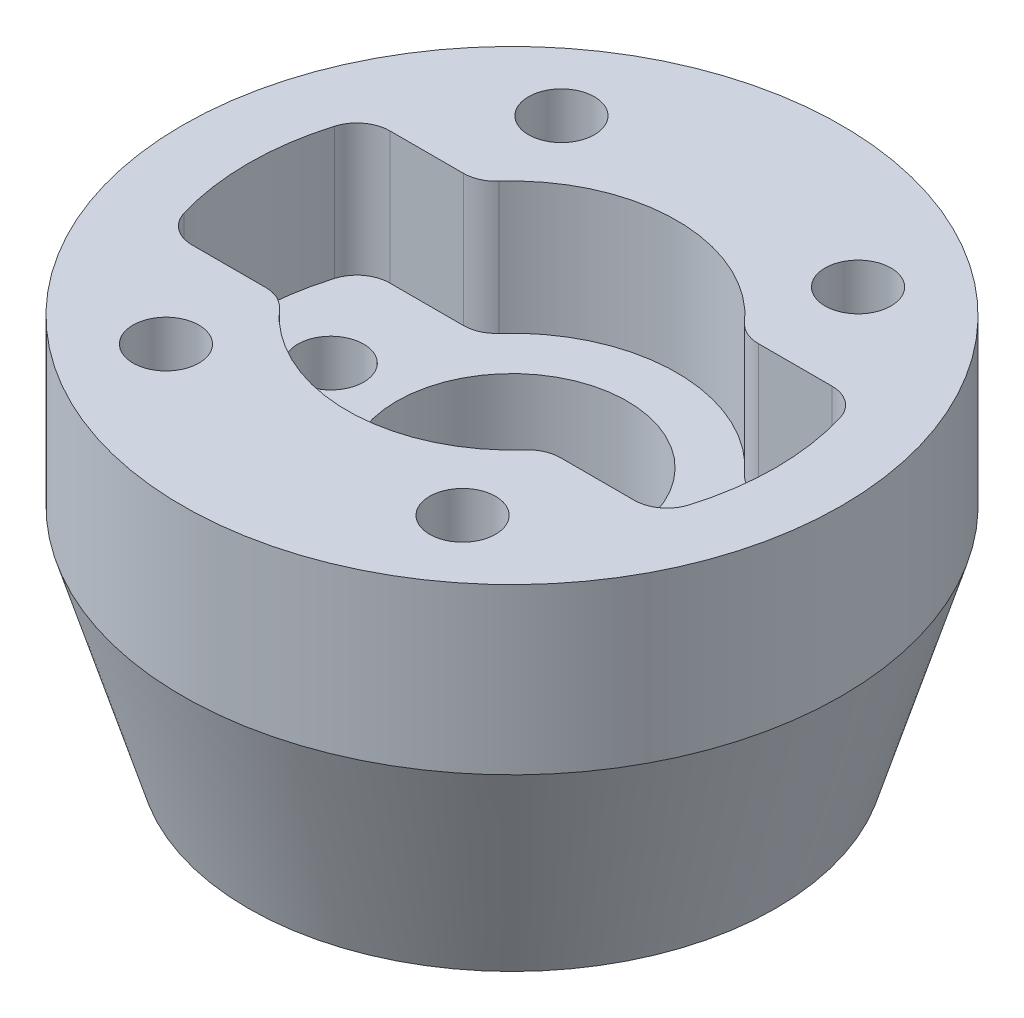
ISO-10303-21;
HEADER;
FILE_DESCRIPTION(('STEP AP214'),'2;1');
FILE_NAME('part.step','',(''),(''),'','','');
FILE_SCHEMA(('AUTOMOTIVE_DESIGN { 1 0 10303 214 1 1 1 1 }'));
ENDSEC;
DATA;
#1=APPLICATION_CONTEXT('core data for automotive mechanical design processes');
#2=APPLICATION_PROTOCOL_DEFINITION('international standard','automotive_design',2000,#1);
#3=PRODUCT_CONTEXT('',#1,'mechanical');
#4=PRODUCT('Part','Part','',(#3));
#5=PRODUCT_RELATED_PRODUCT_CATEGORY('part','',(#4));
#6=PRODUCT_DEFINITION_FORMATION('','',#4);
#7=PRODUCT_DEFINITION_CONTEXT('part definition',#1,'design');
#8=PRODUCT_DEFINITION('design','',#6,#7);
#9=PRODUCT_DEFINITION_SHAPE('','',#8);
#10=(LENGTH_UNIT() NAMED_UNIT(*) SI_UNIT(.MILLI.,.METRE.));
#11=(NAMED_UNIT(*) PLANE_ANGLE_UNIT() SI_UNIT($,.RADIAN.));
#12=(NAMED_UNIT(*) SI_UNIT($,.STERADIAN.) SOLID_ANGLE_UNIT());
#13=UNCERTAINTY_MEASURE_WITH_UNIT(LENGTH_MEASURE(1.E-05),#10,'distance_accuracy_value','');
#14=(GEOMETRIC_REPRESENTATION_CONTEXT(3) GLOBAL_UNCERTAINTY_ASSIGNED_CONTEXT((#13)) GLOBAL_UNIT_ASSIGNED_CONTEXT((#10,
#11,#12)) REPRESENTATION_CONTEXT('',''));
#15=CARTESIAN_POINT('',(0.,0.,0.));
#16=DIRECTION('',(0.,0.,1.));
#17=DIRECTION('',(1.,0.,0.));
#18=AXIS2_PLACEMENT_3D('',#15,#16,#17);
#19=CARTESIAN_POINT('',(0.,0.286130795692241,0.));
#20=DIRECTION('',(0.,1.,0.));
#21=DIRECTION('',(-1.,0.,0.));
#22=AXIS2_PLACEMENT_3D('',#19,#20,#21);
#23=CYLINDRICAL_SURFACE('',#22,3.5);
#24=CARTESIAN_POINT('',(0.,4.,0.));
#25=DIRECTION('',(0.,1.,0.));
#26=DIRECTION('',(-1.,0.,0.));
#27=AXIS2_PLACEMENT_3D('',#24,#25,#26);
#28=CIRCLE('',#27,3.5);
#29=CARTESIAN_POINT('',(-3.5,4.,0.));
#30=VERTEX_POINT('',#29);
#31=EDGE_CURVE('E224',#30,#30,#28,.T.);
#32=ORIENTED_EDGE('',*,*,#31,.F.);
#33=EDGE_LOOP('',(#32));
#34=FACE_BOUND('',#33,.T.);
#35=CARTESIAN_POINT('',(0.,8.5,0.));
#36=DIRECTION('',(0.,1.,0.));
#37=DIRECTION('',(-1.,0.,0.));
#38=AXIS2_PLACEMENT_3D('',#35,#36,#37);
#39=CIRCLE('',#38,3.5);
#40=CARTESIAN_POINT('',(-3.5,8.5,0.));
#41=VERTEX_POINT('',#40);
#42=EDGE_CURVE('E212',#41,#41,#39,.F.);
#43=ORIENTED_EDGE('',*,*,#42,.F.);
#44=EDGE_LOOP('',(#43));
#45=FACE_BOUND('',#44,.T.);
#46=ADVANCED_FACE('F39',(#34,#45),#23,.F.);
#47=CARTESIAN_POINT('',(2.,0.,0.));
#48=DIRECTION('',(0.,1.,0.));
#49=DIRECTION('',(-1.,0.,0.));
#50=AXIS2_PLACEMENT_3D('',#47,#48,#49);
#51=PLANE('',#50);
#52=CARTESIAN_POINT('',(0.,0.,0.));
#53=DIRECTION('',(0.,1.,0.));
#54=DIRECTION('',(-1.,0.,0.));
#55=AXIS2_PLACEMENT_3D('',#52,#53,#54);
#56=CIRCLE('',#55,2.2);
#57=CARTESIAN_POINT('',(-2.2,0.,0.));
#58=VERTEX_POINT('',#57);
#59=EDGE_CURVE('E240',#58,#58,#56,.T.);
#60=ORIENTED_EDGE('',*,*,#59,.F.);
#61=EDGE_LOOP('',(#60));
#62=FACE_BOUND('',#61,.T.);
#63=CARTESIAN_POINT('',(0.,0.,0.));
#64=DIRECTION('',(0.,1.,0.));
#65=DIRECTION('',(-1.,0.,0.));
#66=AXIS2_PLACEMENT_3D('',#63,#64,#65);
#67=CIRCLE('',#66,2.);
#68=CARTESIAN_POINT('',(-2.,0.,0.));
#69=VERTEX_POINT('',#68);
#70=EDGE_CURVE('E207',#69,#69,#67,.T.);
#71=ORIENTED_EDGE('',*,*,#70,.T.);
#72=EDGE_LOOP('',(#71));
#73=FACE_BOUND('',#72,.T.);
#74=ADVANCED_FACE('F395',(#62,#73),#51,.F.);
#75=CARTESIAN_POINT('',(0.,0.,0.));
#76=DIRECTION('',(0.,1.,0.));
#77=DIRECTION('',(-1.,0.,0.));
#78=AXIS2_PLACEMENT_3D('',#75,#76,#77);
#79=CONICAL_SURFACE('',#78,2.2,1.41371669411541);
#80=CARTESIAN_POINT('',(0.,0.918629753882311,0.));
#81=DIRECTION('',(0.,1.,0.));
#82=DIRECTION('',(-1.,0.,0.));
#83=AXIS2_PLACEMENT_3D('',#80,#81,#82);
#84=CIRCLE('',#83,8.);
#85=CARTESIAN_POINT('',(-8.,0.91862975388231,0.));
#86=VERTEX_POINT('',#85);
#87=EDGE_CURVE('E236',#86,#86,#84,.T.);
#88=CARTESIAN_POINT('',(-8.,0.91862975388231,0.));
#89=CARTESIAN_POINT('',(-7.93958333333333,0.909060693946036,0.));
#90=CARTESIAN_POINT('',(-7.87916666666667,0.899491634009762,0.));
#91=CARTESIAN_POINT('',(-7.75833333333333,0.880353514137213,0.));
#92=CARTESIAN_POINT('',(-7.69791666666667,0.870784454200939,0.));
#93=CARTESIAN_POINT('',(-7.57708333333334,0.851646334328391,0.));
#94=CARTESIAN_POINT('',(-7.51666666666667,0.842077274392117,0.));
#95=CARTESIAN_POINT('',(-7.39583333333333,0.822939154519569,0.));
#96=CARTESIAN_POINT('',(-7.33541666666667,0.813370094583295,0.));
#97=CARTESIAN_POINT('',(-7.21458333333333,0.794231974710747,0.));
#98=CARTESIAN_POINT('',(-7.15416666666667,0.784662914774473,0.));
#99=CARTESIAN_POINT('',(-7.03333333333333,0.765524794901925,0.));
#100=CARTESIAN_POINT('',(-6.97291666666667,0.755955734965651,0.));
#101=CARTESIAN_POINT('',(-6.85208333333333,0.736817615093103,0.));
#102=CARTESIAN_POINT('',(-6.79166666666667,0.727248555156828,0.));
#103=CARTESIAN_POINT('',(-6.67083333333333,0.70811043528428,0.));
#104=CARTESIAN_POINT('',(-6.61041666666667,0.698541375348006,0.));
#105=CARTESIAN_POINT('',(-6.48958333333333,0.679403255475458,0.));
#106=CARTESIAN_POINT('',(-6.42916666666667,0.669834195539184,0.));
#107=CARTESIAN_POINT('',(-6.30833333333333,0.650696075666636,0.));
#108=CARTESIAN_POINT('',(-6.24791666666667,0.641127015730362,0.));
#109=CARTESIAN_POINT('',(-6.12708333333333,0.621988895857814,0.));
#110=CARTESIAN_POINT('',(-6.06666666666667,0.61241983592154,0.));
#111=CARTESIAN_POINT('',(-5.94583333333333,0.593281716048991,0.));
#112=CARTESIAN_POINT('',(-5.88541666666667,0.583712656112717,0.));
#113=CARTESIAN_POINT('',(-5.76458333333333,0.564574536240169,0.));
#114=CARTESIAN_POINT('',(-5.70416666666667,0.555005476303895,0.));
#115=CARTESIAN_POINT('',(-5.58333333333333,0.535867356431347,0.));
#116=CARTESIAN_POINT('',(-5.52291666666667,0.526298296495073,0.));
#117=CARTESIAN_POINT('',(-5.40208333333333,0.507160176622525,0.));
#118=CARTESIAN_POINT('',(-5.34166666666667,0.497591116686251,0.));
#119=CARTESIAN_POINT('',(-5.22083333333333,0.478452996813703,0.));
#120=CARTESIAN_POINT('',(-5.16041666666667,0.468883936877429,0.));
#121=CARTESIAN_POINT('',(-5.03958333333333,0.449745817004881,0.));
#122=CARTESIAN_POINT('',(-4.97916666666667,0.440176757068606,0.));
#123=CARTESIAN_POINT('',(-4.85833333333333,0.421038637196058,0.));
#124=CARTESIAN_POINT('',(-4.79791666666667,0.411469577259784,0.));
#125=CARTESIAN_POINT('',(-4.67708333333333,0.392331457387236,0.));
#126=CARTESIAN_POINT('',(-4.61666666666667,0.382762397450962,0.));
#127=CARTESIAN_POINT('',(-4.49583333333333,0.363624277578414,0.));
#128=CARTESIAN_POINT('',(-4.43541666666667,0.35405521764214,0.));
#129=CARTESIAN_POINT('',(-4.31458333333333,0.334917097769592,0.));
#130=CARTESIAN_POINT('',(-4.25416666666667,0.325348037833318,0.));
#131=CARTESIAN_POINT('',(-4.13333333333333,0.30620991796077,0.));
#132=CARTESIAN_POINT('',(-4.07291666666667,0.296640858024496,0.));
#133=CARTESIAN_POINT('',(-3.95208333333333,0.277502738151947,0.));
#134=CARTESIAN_POINT('',(-3.89166666666667,0.267933678215673,0.));
#135=CARTESIAN_POINT('',(-3.77083333333333,0.248795558343125,0.));
#136=CARTESIAN_POINT('',(-3.71041666666667,0.239226498406851,0.));
#137=CARTESIAN_POINT('',(-3.58958333333333,0.220088378534303,0.));
#138=CARTESIAN_POINT('',(-3.52916666666667,0.210519318598029,0.));
#139=CARTESIAN_POINT('',(-3.40833333333333,0.191381198725481,0.));
#140=CARTESIAN_POINT('',(-3.34791666666667,0.181812138789207,0.));
#141=CARTESIAN_POINT('',(-3.22708333333333,0.162674018916659,0.));
#142=CARTESIAN_POINT('',(-3.16666666666667,0.153104958980384,0.));
#143=CARTESIAN_POINT('',(-3.04583333333333,0.133966839107836,0.));
#144=CARTESIAN_POINT('',(-2.98541666666667,0.124397779171562,0.));
#145=CARTESIAN_POINT('',(-2.86458333333333,0.105259659299014,0.));
#146=CARTESIAN_POINT('',(-2.80416666666667,0.0956905993627402,0.));
#147=CARTESIAN_POINT('',(-2.68333333333333,0.076552479490192,0.));
#148=CARTESIAN_POINT('',(-2.62291666666667,0.0669834195539179,0.));
#149=CARTESIAN_POINT('',(-2.50208333333333,0.0478452996813698,0.));
#150=CARTESIAN_POINT('',(-2.44166666666667,0.0382762397450957,0.));
#151=CARTESIAN_POINT('',(-2.32083333333333,0.0191381198725476,0.));
#152=CARTESIAN_POINT('',(-2.26041666666667,0.00956905993627356,0.));
#153=CARTESIAN_POINT('',(-2.2,0.,0.));
#154=B_SPLINE_CURVE_WITH_KNOTS('',3,(#88,#89,#90,#91,#92,#93,#94,#95,#96,#97,#98,#99,#100,#101,
#102,#103,#104,#105,#106,#107,#108,#109,#110,#111,#112,#113,#114,#115,#116,#117,#118,#119,#120,
#121,#122,#123,#124,#125,#126,#127,#128,#129,#130,#131,#132,#133,#134,#135,#136,#137,#138,#139,
#140,#141,#142,#143,#144,#145,#146,#147,#148,#149,#150,#151,#152,#153),.UNSPECIFIED.,.F.,.F.,(4,
2,2,2,2,2,2,2,2,2,2,2,2,2,2,2,2,2,2,2,2,2,2,2,2,2,2,2,2,2,2,2,4),(0.,0.183509304049076,
0.367018608098151,0.550527912147227,0.734037216196304,0.917546520245378,1.10105582429445,
1.28456512834353,1.46807443239261,1.65158373644168,1.83509304049076,2.01860234453983,
2.20211164858891,2.38562095263798,2.56913025668706,2.75263956073613,2.93614886478521,
3.11965816883428,3.30316747288336,3.48667677693244,3.67018608098151,3.85369538503059,
4.03720468907966,4.22071399312874,4.40422329717781,4.58773260122689,4.77124190527597,
4.95475120932504,5.13826051337412,5.32176981742319,5.50527912147227,5.68878842552134,
5.87229772957042),.UNSPECIFIED.);
#155=EDGE_CURVE('BSEAM401',#86,#58,#154,.T.);
#156=ORIENTED_EDGE('',*,*,#87,.F.);
#157=ORIENTED_EDGE('',*,*,#59,.T.);
#158=ORIENTED_EDGE('',*,*,#155,.T.);
#159=ORIENTED_EDGE('',*,*,#155,.F.);
#160=EDGE_LOOP('',(#156,#158,#157,#159));
#161=FACE_BOUND('',#160,.T.);
#162=ADVANCED_FACE('F401',(#161),#79,.T.);
#163=CARTESIAN_POINT('',(0.,0.918629753882311,0.));
#164=DIRECTION('',(0.,1.,0.));
#165=DIRECTION('',(-1.,0.,0.));
#166=AXIS2_PLACEMENT_3D('',#163,#164,#165);
#167=CONICAL_SURFACE('',#166,8.,0.295020016675106);
#168=CARTESIAN_POINT('',(0.,7.5,0.));
#169=DIRECTION('',(0.,1.,0.));
#170=DIRECTION('',(-1.,0.,0.));
#171=AXIS2_PLACEMENT_3D('',#168,#169,#170);
#172=CIRCLE('',#171,10.);
#173=CARTESIAN_POINT('',(-10.,7.5,0.));
#174=VERTEX_POINT('',#173);
#175=EDGE_CURVE('E232',#174,#174,#172,.T.);
#176=ORIENTED_EDGE('',*,*,#175,.F.);
#177=EDGE_LOOP('',(#176));
#178=FACE_BOUND('',#177,.T.);
#179=ORIENTED_EDGE('',*,*,#87,.T.);
#180=EDGE_LOOP('',(#179));
#181=FACE_BOUND('',#180,.T.);
#182=ADVANCED_FACE('F416',(#178,#181),#167,.T.);
#183=CARTESIAN_POINT('',(0.,0.286130795692241,0.));
#184=DIRECTION('',(0.,1.,0.));
#185=DIRECTION('',(-1.,0.,0.));
#186=AXIS2_PLACEMENT_3D('',#183,#184,#185);
#187=CYLINDRICAL_SURFACE('',#186,10.);
#188=CARTESIAN_POINT('',(0.,12.5,0.));
#189=DIRECTION('',(0.,1.,0.));
#190=DIRECTION('',(-1.,0.,0.));
#191=AXIS2_PLACEMENT_3D('',#188,#189,#190);
#192=CIRCLE('',#191,10.);
#193=CARTESIAN_POINT('',(-10.,12.5,0.));
#194=VERTEX_POINT('',#193);
#195=EDGE_CURVE('E228',#194,#194,#192,.T.);
#196=ORIENTED_EDGE('',*,*,#195,.F.);
#197=EDGE_LOOP('',(#196));
#198=FACE_BOUND('',#197,.T.);
#199=ORIENTED_EDGE('',*,*,#175,.T.);
#200=EDGE_LOOP('',(#199));
#201=FACE_BOUND('',#200,.T.);
#202=ADVANCED_FACE('F412',(#198,#201),#187,.T.);
#203=CARTESIAN_POINT('',(3.5,12.5,0.));
#204=DIRECTION('',(0.,-1.,0.));
#205=DIRECTION('',(1.,0.,0.));
#206=AXIS2_PLACEMENT_3D('',#203,#204,#205);
#207=PLANE('',#206);
#208=CARTESIAN_POINT('',(4.5,12.5,-6.));
#209=DIRECTION('',(0.,1.,0.));
#210=DIRECTION('',(-1.,0.,0.));
#211=AXIS2_PLACEMENT_3D('',#208,#209,#210);
#212=CIRCLE('',#211,1.);
#213=CARTESIAN_POINT('',(3.5,12.5,-6.));
#214=VERTEX_POINT('',#213);
#215=EDGE_CURVE('E763',#214,#214,#212,.T.);
#216=ORIENTED_EDGE('',*,*,#215,.F.);
#217=EDGE_LOOP('',(#216));
#218=FACE_BOUND('',#217,.T.);
#219=CARTESIAN_POINT('',(-4.5,12.5,6.));
#220=DIRECTION('',(0.,1.,0.));
#221=DIRECTION('',(-1.,0.,0.));
#222=AXIS2_PLACEMENT_3D('',#219,#220,#221);
#223=CIRCLE('',#222,1.);
#224=CARTESIAN_POINT('',(-5.5,12.5,6.));
#225=VERTEX_POINT('',#224);
#226=EDGE_CURVE('E780',#225,#225,#223,.T.);
#227=ORIENTED_EDGE('',*,*,#226,.F.);
#228=EDGE_LOOP('',(#227));
#229=FACE_BOUND('',#228,.T.);
#230=CARTESIAN_POINT('',(4.5,12.5,6.));
#231=DIRECTION('',(0.,1.,0.));
#232=DIRECTION('',(-1.,0.,0.));
#233=AXIS2_PLACEMENT_3D('',#230,#231,#232);
#234=CIRCLE('',#233,1.);
#235=CARTESIAN_POINT('',(3.5,12.5,6.));
#236=VERTEX_POINT('',#235);
#237=EDGE_CURVE('E774',#236,#236,#234,.T.);
#238=ORIENTED_EDGE('',*,*,#237,.F.);
#239=EDGE_LOOP('',(#238));
#240=FACE_BOUND('',#239,.T.);
#241=CARTESIAN_POINT('',(-4.5,12.5,-6.));
#242=DIRECTION('',(0.,1.,0.));
#243=DIRECTION('',(-1.,0.,0.));
#244=AXIS2_PLACEMENT_3D('',#241,#242,#243);
#245=CIRCLE('',#244,1.);
#246=CARTESIAN_POINT('',(-5.5,12.5,-6.));
#247=VERTEX_POINT('',#246);
#248=EDGE_CURVE('E762',#247,#247,#245,.T.);
#249=ORIENTED_EDGE('',*,*,#248,.F.);
#250=EDGE_LOOP('',(#249));
#251=FACE_BOUND('',#250,.T.);
#252=DIRECTION('',(1.,0.,0.));
#253=VECTOR('',#252,1.);
#254=CARTESIAN_POINT('',(7.41619848709566,12.5,3.));
#255=LINE('',#254,#253);
#256=CARTESIAN_POINT('',(4.47213595499958,12.5,3.));
#257=VERTEX_POINT('',#256);
#258=CARTESIAN_POINT('',(6.70820393249937,12.5,3.));
#259=VERTEX_POINT('',#258);
#260=EDGE_CURVE('E171',#257,#259,#255,.T.);
#261=ORIENTED_EDGE('',*,*,#260,.F.);
#262=CARTESIAN_POINT('',(4.47213595499958,12.5,4.));
#263=DIRECTION('',(0.,-1.,0.));
#264=DIRECTION('',(1.,0.,0.));
#265=AXIS2_PLACEMENT_3D('',#262,#263,#264);
#266=CIRCLE('',#265,1.);
#267=CARTESIAN_POINT('',(3.72677996249965,12.5,3.33333333333333));
#268=VERTEX_POINT('',#267);
#269=EDGE_CURVE('E153',#257,#268,#266,.F.);
#270=ORIENTED_EDGE('',*,*,#269,.T.);
#271=CARTESIAN_POINT('',(0.,12.5,0.));
#272=DIRECTION('',(0.,1.,0.));
#273=DIRECTION('',(-1.,0.,0.));
#274=AXIS2_PLACEMENT_3D('',#271,#272,#273);
#275=CIRCLE('',#274,5.);
#276=CARTESIAN_POINT('',(-3.72677996249965,12.5,3.33333333333333));
#277=VERTEX_POINT('',#276);
#278=EDGE_CURVE('E185',#277,#268,#275,.T.);
#279=ORIENTED_EDGE('',*,*,#278,.F.);
#280=CARTESIAN_POINT('',(-4.47213595499958,12.5,4.));
#281=DIRECTION('',(0.,-1.,0.));
#282=DIRECTION('',(1.,0.,0.));
#283=AXIS2_PLACEMENT_3D('',#280,#281,#282);
#284=CIRCLE('',#283,1.);
#285=CARTESIAN_POINT('',(-4.47213595499958,12.5,3.));
#286=VERTEX_POINT('',#285);
#287=EDGE_CURVE('E252',#277,#286,#284,.F.);
#288=ORIENTED_EDGE('',*,*,#287,.T.);
#289=DIRECTION('',(1.,0.,0.));
#290=VECTOR('',#289,1.);
#291=CARTESIAN_POINT('',(-7.41619848709567,12.5,3.));
#292=LINE('',#291,#290);
#293=CARTESIAN_POINT('',(-6.70820393249937,12.5,3.));
#294=VERTEX_POINT('',#293);
#295=EDGE_CURVE('E192',#294,#286,#292,.T.);
#296=ORIENTED_EDGE('',*,*,#295,.F.);
#297=CARTESIAN_POINT('',(-6.70820393249937,12.5,2.));
#298=DIRECTION('',(0.,-1.,0.));
#299=DIRECTION('',(1.,0.,0.));
#300=AXIS2_PLACEMENT_3D('',#297,#298,#299);
#301=CIRCLE('',#300,1.);
#302=CARTESIAN_POINT('',(-7.66651877999928,12.5,2.28571428571429));
#303=VERTEX_POINT('',#302);
#304=EDGE_CURVE('E329',#294,#303,#301,.T.);
#305=ORIENTED_EDGE('',*,*,#304,.T.);
#306=CARTESIAN_POINT('',(0.,12.5,0.));
#307=DIRECTION('',(0.,1.,0.));
#308=DIRECTION('',(-1.,0.,0.));
#309=AXIS2_PLACEMENT_3D('',#306,#307,#308);
#310=CIRCLE('',#309,8.);
#311=CARTESIAN_POINT('',(-7.66651877999928,12.5,-2.28571428571429));
#312=VERTEX_POINT('',#311);
#313=EDGE_CURVE('E364',#312,#303,#310,.T.);
#314=ORIENTED_EDGE('',*,*,#313,.F.);
#315=CARTESIAN_POINT('',(-6.70820393249937,12.5,-2.));
#316=DIRECTION('',(0.,-1.,0.));
#317=DIRECTION('',(1.,0.,0.));
#318=AXIS2_PLACEMENT_3D('',#315,#316,#317);
#319=CIRCLE('',#318,1.);
#320=CARTESIAN_POINT('',(-6.70820393249937,12.5,-3.));
#321=VERTEX_POINT('',#320);
#322=EDGE_CURVE('E11',#312,#321,#319,.T.);
#323=ORIENTED_EDGE('',*,*,#322,.T.);
#324=DIRECTION('',(-1.,0.,0.));
#325=VECTOR('',#324,1.);
#326=CARTESIAN_POINT('',(-7.41619848709567,12.5,-3.));
#327=LINE('',#326,#325);
#328=CARTESIAN_POINT('',(-4.47213595499958,12.5,-3.));
#329=VERTEX_POINT('',#328);
#330=EDGE_CURVE('E203',#329,#321,#327,.T.);
#331=ORIENTED_EDGE('',*,*,#330,.F.);
#332=CARTESIAN_POINT('',(-4.47213595499958,12.5,-4.));
#333=DIRECTION('',(0.,-1.,0.));
#334=DIRECTION('',(1.,0.,0.));
#335=AXIS2_PLACEMENT_3D('',#332,#333,#334);
#336=CIRCLE('',#335,1.);
#337=CARTESIAN_POINT('',(-3.72677996249965,12.5,-3.33333333333333));
#338=VERTEX_POINT('',#337);
#339=EDGE_CURVE('E176',#329,#338,#336,.F.);
#340=ORIENTED_EDGE('',*,*,#339,.T.);
#341=CARTESIAN_POINT('',(0.,12.5,0.));
#342=DIRECTION('',(0.,1.,0.));
#343=DIRECTION('',(-1.,0.,0.));
#344=AXIS2_PLACEMENT_3D('',#341,#342,#343);
#345=CIRCLE('',#344,5.);
#346=CARTESIAN_POINT('',(3.72677996249965,12.5,-3.33333333333333));
#347=VERTEX_POINT('',#346);
#348=EDGE_CURVE('E199',#347,#338,#345,.T.);
#349=ORIENTED_EDGE('',*,*,#348,.F.);
#350=CARTESIAN_POINT('',(4.47213595499958,12.5,-4.));
#351=DIRECTION('',(0.,-1.,0.));
#352=DIRECTION('',(1.,0.,0.));
#353=AXIS2_PLACEMENT_3D('',#350,#351,#352);
#354=CIRCLE('',#353,1.);
#355=CARTESIAN_POINT('',(4.47213595499958,12.5,-3.));
#356=VERTEX_POINT('',#355);
#357=EDGE_CURVE('E165',#347,#356,#354,.F.);
#358=ORIENTED_EDGE('',*,*,#357,.T.);
#359=DIRECTION('',(-1.,0.,0.));
#360=VECTOR('',#359,1.);
#361=CARTESIAN_POINT('',(7.41619848709566,12.5,-3.));
#362=LINE('',#361,#360);
#363=CARTESIAN_POINT('',(6.70820393249937,12.5,-3.));
#364=VERTEX_POINT('',#363);
#365=EDGE_CURVE('E190',#364,#356,#362,.T.);
#366=ORIENTED_EDGE('',*,*,#365,.F.);
#367=CARTESIAN_POINT('',(6.70820393249937,12.5,-2.));
#368=DIRECTION('',(0.,-1.,0.));
#369=DIRECTION('',(1.,0.,0.));
#370=AXIS2_PLACEMENT_3D('',#367,#368,#369);
#371=CIRCLE('',#370,1.);
#372=CARTESIAN_POINT('',(7.66651877999928,12.5,-2.28571428571429));
#373=VERTEX_POINT('',#372);
#374=EDGE_CURVE('E320',#364,#373,#371,.T.);
#375=ORIENTED_EDGE('',*,*,#374,.T.);
#376=CARTESIAN_POINT('',(0.,12.5,0.));
#377=DIRECTION('',(0.,1.,0.));
#378=DIRECTION('',(-1.,0.,0.));
#379=AXIS2_PLACEMENT_3D('',#376,#377,#378);
#380=CIRCLE('',#379,8.);
#381=CARTESIAN_POINT('',(7.66651877999928,12.5,2.28571428571429));
#382=VERTEX_POINT('',#381);
#383=EDGE_CURVE('E184',#382,#373,#380,.T.);
#384=ORIENTED_EDGE('',*,*,#383,.F.);
#385=CARTESIAN_POINT('',(6.70820393249937,12.5,2.));
#386=DIRECTION('',(0.,-1.,0.));
#387=DIRECTION('',(1.,0.,0.));
#388=AXIS2_PLACEMENT_3D('',#385,#386,#387);
#389=CIRCLE('',#388,1.);
#390=EDGE_CURVE('E182',#382,#259,#389,.T.);
#391=ORIENTED_EDGE('',*,*,#390,.T.);
#392=EDGE_LOOP('',(#261,#270,#279,#288,#296,#305,#314,#323,#331,#340,#349,#358,#366,#375,#384,#391));
#393=FACE_BOUND('',#392,.T.);
#394=ORIENTED_EDGE('',*,*,#195,.T.);
#395=EDGE_LOOP('',(#394));
#396=FACE_BOUND('',#395,.T.);
#397=ADVANCED_FACE('F179',(#218,#229,#240,#251,#393,#396),#207,.F.);
#398=CARTESIAN_POINT('',(3.,4.,0.));
#399=DIRECTION('',(0.,-1.,0.));
#400=DIRECTION('',(1.,0.,0.));
#401=AXIS2_PLACEMENT_3D('',#398,#399,#400);
#402=PLANE('',#401);
#403=CARTESIAN_POINT('',(0.,4.,0.));
#404=DIRECTION('',(0.,1.,0.));
#405=DIRECTION('',(-1.,0.,0.));
#406=AXIS2_PLACEMENT_3D('',#403,#404,#405);
#407=CIRCLE('',#406,3.);
#408=CARTESIAN_POINT('',(-3.,4.,0.));
#409=VERTEX_POINT('',#408);
#410=EDGE_CURVE('E220',#409,#409,#407,.T.);
#411=ORIENTED_EDGE('',*,*,#410,.F.);
#412=EDGE_LOOP('',(#411));
#413=FACE_BOUND('',#412,.T.);
#414=ORIENTED_EDGE('',*,*,#31,.T.);
#415=EDGE_LOOP('',(#414));
#416=FACE_BOUND('',#415,.T.);
#417=ADVANCED_FACE('F408',(#413,#416),#402,.F.);
#418=CARTESIAN_POINT('',(0.,0.286130795692241,0.));
#419=DIRECTION('',(0.,1.,0.));
#420=DIRECTION('',(-1.,0.,0.));
#421=AXIS2_PLACEMENT_3D('',#418,#419,#420);
#422=CYLINDRICAL_SURFACE('',#421,3.);
#423=CARTESIAN_POINT('',(0.,2.,0.));
#424=DIRECTION('',(0.,1.,0.));
#425=DIRECTION('',(-1.,0.,0.));
#426=AXIS2_PLACEMENT_3D('',#423,#424,#425);
#427=CIRCLE('',#426,3.);
#428=CARTESIAN_POINT('',(-3.,2.,0.));
#429=VERTEX_POINT('',#428);
#430=EDGE_CURVE('E216',#429,#429,#427,.T.);
#431=ORIENTED_EDGE('',*,*,#430,.F.);
#432=EDGE_LOOP('',(#431));
#433=FACE_BOUND('',#432,.T.);
#434=ORIENTED_EDGE('',*,*,#410,.T.);
#435=EDGE_LOOP('',(#434));
#436=FACE_BOUND('',#435,.T.);
#437=ADVANCED_FACE('F479',(#433,#436),#422,.F.);
#438=CARTESIAN_POINT('',(2.,2.,0.));
#439=DIRECTION('',(0.,-1.,0.));
#440=DIRECTION('',(1.,0.,0.));
#441=AXIS2_PLACEMENT_3D('',#438,#439,#440);
#442=PLANE('',#441);
#443=CARTESIAN_POINT('',(0.,2.,0.));
#444=DIRECTION('',(0.,1.,0.));
#445=DIRECTION('',(-1.,0.,0.));
#446=AXIS2_PLACEMENT_3D('',#443,#444,#445);
#447=CIRCLE('',#446,2.);
#448=CARTESIAN_POINT('',(-2.,2.,0.));
#449=VERTEX_POINT('',#448);
#450=EDGE_CURVE('E211',#449,#449,#447,.T.);
#451=ORIENTED_EDGE('',*,*,#450,.F.);
#452=EDGE_LOOP('',(#451));
#453=FACE_BOUND('',#452,.T.);
#454=ORIENTED_EDGE('',*,*,#430,.T.);
#455=EDGE_LOOP('',(#454));
#456=FACE_BOUND('',#455,.T.);
#457=ADVANCED_FACE('F476',(#453,#456),#442,.F.);
#458=CARTESIAN_POINT('',(0.,0.286130795692241,0.));
#459=DIRECTION('',(0.,1.,0.));
#460=DIRECTION('',(-1.,0.,0.));
#461=AXIS2_PLACEMENT_3D('',#458,#459,#460);
#462=CYLINDRICAL_SURFACE('',#461,2.);
#463=ORIENTED_EDGE('',*,*,#70,.F.);
#464=EDGE_LOOP('',(#463));
#465=FACE_BOUND('',#464,.T.);
#466=ORIENTED_EDGE('',*,*,#450,.T.);
#467=EDGE_LOOP('',(#466));
#468=FACE_BOUND('',#467,.T.);
#469=ADVANCED_FACE('F470',(#465,#468),#462,.F.);
#470=CARTESIAN_POINT('',(0.,8.5,0.));
#471=DIRECTION('',(0.,1.,0.));
#472=DIRECTION('',(-1.,0.,0.));
#473=AXIS2_PLACEMENT_3D('',#470,#471,#472);
#474=PLANE('',#473);
#475=CARTESIAN_POINT('',(5.5,8.5,0.));
#476=DIRECTION('',(0.,1.,0.));
#477=DIRECTION('',(-1.,0.,0.));
#478=AXIS2_PLACEMENT_3D('',#475,#476,#477);
#479=CIRCLE('',#478,1.);
#480=CARTESIAN_POINT('',(4.5,8.5,0.));
#481=VERTEX_POINT('',#480);
#482=EDGE_CURVE('E791',#481,#481,#479,.T.);
#483=ORIENTED_EDGE('',*,*,#482,.F.);
#484=EDGE_LOOP('',(#483));
#485=FACE_BOUND('',#484,.T.);
#486=CARTESIAN_POINT('',(-5.5,8.5,0.));
#487=DIRECTION('',(0.,1.,0.));
#488=DIRECTION('',(1.,0.,0.));
#489=AXIS2_PLACEMENT_3D('',#486,#487,#488);
#490=CIRCLE('',#489,1.);
#491=CARTESIAN_POINT('',(-4.5,8.5,0.));
#492=VERTEX_POINT('',#491);
#493=EDGE_CURVE('E361',#492,#492,#490,.T.);
#494=ORIENTED_EDGE('',*,*,#493,.F.);
#495=EDGE_LOOP('',(#494));
#496=FACE_BOUND('',#495,.T.);
#497=DIRECTION('',(1.,0.,0.));
#498=VECTOR('',#497,1.);
#499=CARTESIAN_POINT('',(7.41619848709566,8.5,3.));
#500=LINE('',#499,#498);
#501=CARTESIAN_POINT('',(4.47213595499958,8.5,3.));
#502=VERTEX_POINT('',#501);
#503=CARTESIAN_POINT('',(6.70820393249937,8.5,3.));
#504=VERTEX_POINT('',#503);
#505=EDGE_CURVE('E174',#502,#504,#500,.T.);
#506=ORIENTED_EDGE('',*,*,#505,.T.);
#507=CARTESIAN_POINT('',(6.70820393249937,8.5,2.));
#508=DIRECTION('',(0.,1.,0.));
#509=DIRECTION('',(-1.,0.,0.));
#510=AXIS2_PLACEMENT_3D('',#507,#508,#509);
#511=CIRCLE('',#510,1.);
#512=CARTESIAN_POINT('',(7.66651877999928,8.5,2.28571428571429));
#513=VERTEX_POINT('',#512);
#514=EDGE_CURVE('E278',#504,#513,#511,.T.);
#515=ORIENTED_EDGE('',*,*,#514,.T.);
#516=CARTESIAN_POINT('',(0.,8.5,0.));
#517=DIRECTION('',(0.,1.,0.));
#518=DIRECTION('',(-1.,0.,0.));
#519=AXIS2_PLACEMENT_3D('',#516,#517,#518);
#520=CIRCLE('',#519,8.);
#521=CARTESIAN_POINT('',(7.66651877999928,8.5,-2.28571428571429));
#522=VERTEX_POINT('',#521);
#523=EDGE_CURVE('E341',#513,#522,#520,.T.);
#524=ORIENTED_EDGE('',*,*,#523,.T.);
#525=CARTESIAN_POINT('',(6.70820393249937,8.5,-2.));
#526=DIRECTION('',(0.,1.,0.));
#527=DIRECTION('',(-1.,0.,0.));
#528=AXIS2_PLACEMENT_3D('',#525,#526,#527);
#529=CIRCLE('',#528,1.);
#530=CARTESIAN_POINT('',(6.70820393249937,8.5,-3.));
#531=VERTEX_POINT('',#530);
#532=EDGE_CURVE('E275',#522,#531,#529,.T.);
#533=ORIENTED_EDGE('',*,*,#532,.T.);
#534=DIRECTION('',(-1.,0.,0.));
#535=VECTOR('',#534,1.);
#536=CARTESIAN_POINT('',(7.41619848709566,8.5,-3.));
#537=LINE('',#536,#535);
#538=CARTESIAN_POINT('',(4.47213595499958,8.5,-3.));
#539=VERTEX_POINT('',#538);
#540=EDGE_CURVE('E337',#531,#539,#537,.T.);
#541=ORIENTED_EDGE('',*,*,#540,.T.);
#542=CARTESIAN_POINT('',(4.47213595499958,8.5,-4.));
#543=DIRECTION('',(0.,1.,0.));
#544=DIRECTION('',(-1.,0.,0.));
#545=AXIS2_PLACEMENT_3D('',#542,#543,#544);
#546=CIRCLE('',#545,1.);
#547=CARTESIAN_POINT('',(3.72677996249965,8.5,-3.33333333333333));
#548=VERTEX_POINT('',#547);
#549=EDGE_CURVE('E323',#539,#548,#546,.F.);
#550=ORIENTED_EDGE('',*,*,#549,.T.);
#551=CARTESIAN_POINT('',(0.,8.5,0.));
#552=DIRECTION('',(0.,1.,0.));
#553=DIRECTION('',(-1.,0.,0.));
#554=AXIS2_PLACEMENT_3D('',#551,#552,#553);
#555=CIRCLE('',#554,5.);
#556=CARTESIAN_POINT('',(-3.72677996249965,8.5,-3.33333333333333));
#557=VERTEX_POINT('',#556);
#558=EDGE_CURVE('E334',#548,#557,#555,.T.);
#559=ORIENTED_EDGE('',*,*,#558,.T.);
#560=CARTESIAN_POINT('',(-4.47213595499958,8.5,-4.));
#561=DIRECTION('',(0.,1.,0.));
#562=DIRECTION('',(-1.,0.,0.));
#563=AXIS2_PLACEMENT_3D('',#560,#561,#562);
#564=CIRCLE('',#563,1.);
#565=CARTESIAN_POINT('',(-4.47213595499958,8.5,-3.));
#566=VERTEX_POINT('',#565);
#567=EDGE_CURVE('E48',#557,#566,#564,.F.);
#568=ORIENTED_EDGE('',*,*,#567,.T.);
#569=DIRECTION('',(-1.,0.,0.));
#570=VECTOR('',#569,1.);
#571=CARTESIAN_POINT('',(-7.41619848709567,8.5,-3.));
#572=LINE('',#571,#570);
#573=CARTESIAN_POINT('',(-6.70820393249937,8.5,-3.));
#574=VERTEX_POINT('',#573);
#575=EDGE_CURVE('E247',#566,#574,#572,.T.);
#576=ORIENTED_EDGE('',*,*,#575,.T.);
#577=CARTESIAN_POINT('',(-6.70820393249937,8.5,-2.));
#578=DIRECTION('',(0.,1.,0.));
#579=DIRECTION('',(-1.,0.,0.));
#580=AXIS2_PLACEMENT_3D('',#577,#578,#579);
#581=CIRCLE('',#580,1.);
#582=CARTESIAN_POINT('',(-7.66651877999928,8.5,-2.28571428571429));
#583=VERTEX_POINT('',#582);
#584=EDGE_CURVE('E269',#574,#583,#581,.T.);
#585=ORIENTED_EDGE('',*,*,#584,.T.);
#586=CARTESIAN_POINT('',(0.,8.5,0.));
#587=DIRECTION('',(0.,1.,0.));
#588=DIRECTION('',(-1.,0.,0.));
#589=AXIS2_PLACEMENT_3D('',#586,#587,#588);
#590=CIRCLE('',#589,8.);
#591=CARTESIAN_POINT('',(-7.66651877999928,8.5,2.28571428571429));
#592=VERTEX_POINT('',#591);
#593=EDGE_CURVE('E206',#583,#592,#590,.T.);
#594=ORIENTED_EDGE('',*,*,#593,.T.);
#595=CARTESIAN_POINT('',(-6.70820393249937,8.5,2.));
#596=DIRECTION('',(0.,1.,0.));
#597=DIRECTION('',(-1.,0.,0.));
#598=AXIS2_PLACEMENT_3D('',#595,#596,#597);
#599=CIRCLE('',#598,1.);
#600=CARTESIAN_POINT('',(-6.70820393249937,8.5,3.));
#601=VERTEX_POINT('',#600);
#602=EDGE_CURVE('E272',#592,#601,#599,.T.);
#603=ORIENTED_EDGE('',*,*,#602,.T.);
#604=DIRECTION('',(1.,0.,0.));
#605=VECTOR('',#604,1.);
#606=CARTESIAN_POINT('',(-7.41619848709567,8.5,3.));
#607=LINE('',#606,#605);
#608=CARTESIAN_POINT('',(-4.47213595499958,8.5,3.));
#609=VERTEX_POINT('',#608);
#610=EDGE_CURVE('E351',#601,#609,#607,.T.);
#611=ORIENTED_EDGE('',*,*,#610,.T.);
#612=CARTESIAN_POINT('',(-4.47213595499958,8.5,4.));
#613=DIRECTION('',(0.,1.,0.));
#614=DIRECTION('',(-1.,0.,0.));
#615=AXIS2_PLACEMENT_3D('',#612,#613,#614);
#616=CIRCLE('',#615,1.);
#617=CARTESIAN_POINT('',(-3.72677996249965,8.5,3.33333333333333));
#618=VERTEX_POINT('',#617);
#619=EDGE_CURVE('E326',#609,#618,#616,.F.);
#620=ORIENTED_EDGE('',*,*,#619,.T.);
#621=CARTESIAN_POINT('',(0.,8.5,0.));
#622=DIRECTION('',(0.,1.,0.));
#623=DIRECTION('',(-1.,0.,0.));
#624=AXIS2_PLACEMENT_3D('',#621,#622,#623);
#625=CIRCLE('',#624,5.);
#626=CARTESIAN_POINT('',(3.72677996249965,8.5,3.33333333333333));
#627=VERTEX_POINT('',#626);
#628=EDGE_CURVE('E347',#618,#627,#625,.T.);
#629=ORIENTED_EDGE('',*,*,#628,.T.);
#630=CARTESIAN_POINT('',(4.47213595499958,8.5,4.));
#631=DIRECTION('',(0.,1.,0.));
#632=DIRECTION('',(-1.,0.,0.));
#633=AXIS2_PLACEMENT_3D('',#630,#631,#632);
#634=CIRCLE('',#633,1.);
#635=EDGE_CURVE('E315',#627,#502,#634,.F.);
#636=ORIENTED_EDGE('',*,*,#635,.T.);
#637=EDGE_LOOP('',(#506,#515,#524,#533,#541,#550,#559,#568,#576,#585,#594,#603,#611,#620,#629,#636));
#638=FACE_BOUND('',#637,.T.);
#639=ORIENTED_EDGE('',*,*,#42,.T.);
#640=EDGE_LOOP('',(#639));
#641=FACE_BOUND('',#640,.T.);
#642=ADVANCED_FACE('F381',(#485,#496,#638,#641),#474,.T.);
#643=CARTESIAN_POINT('',(0.,8.5,0.));
#644=DIRECTION('',(0.,1.,0.));
#645=DIRECTION('',(-1.,0.,0.));
#646=AXIS2_PLACEMENT_3D('',#643,#644,#645);
#647=CYLINDRICAL_SURFACE('',#646,8.);
#648=ORIENTED_EDGE('',*,*,#313,.T.);
#649=DIRECTION('',(0.,1.,0.));
#650=VECTOR('',#649,1.);
#651=CARTESIAN_POINT('',(-7.66651877999928,8.5,2.28571428571429));
#652=LINE('',#651,#650);
#653=EDGE_CURVE('E306',#303,#592,#652,.F.);
#654=ORIENTED_EDGE('',*,*,#653,.T.);
#655=ORIENTED_EDGE('',*,*,#593,.F.);
#656=DIRECTION('',(0.,1.,0.));
#657=VECTOR('',#656,1.);
#658=CARTESIAN_POINT('',(-7.66651877999928,8.5,-2.28571428571429));
#659=LINE('',#658,#657);
#660=EDGE_CURVE('E302',#583,#312,#659,.T.);
#661=ORIENTED_EDGE('',*,*,#660,.T.);
#662=EDGE_LOOP('',(#648,#654,#655,#661));
#663=FACE_BOUND('',#662,.T.);
#664=ADVANCED_FACE('F460',(#663),#647,.F.);
#665=CARTESIAN_POINT('',(-7.41619848709567,8.5,-3.));
#666=DIRECTION('',(0.,0.,-1.));
#667=DIRECTION('',(-1.,0.,0.));
#668=AXIS2_PLACEMENT_3D('',#665,#666,#667);
#669=PLANE('',#668);
#670=ORIENTED_EDGE('',*,*,#575,.F.);
#671=DIRECTION('',(0.,1.,0.));
#672=VECTOR('',#671,1.);
#673=CARTESIAN_POINT('',(-4.47213595499958,8.5,-3.));
#674=LINE('',#673,#672);
#675=EDGE_CURVE('E311',#566,#329,#674,.T.);
#676=ORIENTED_EDGE('',*,*,#675,.T.);
#677=ORIENTED_EDGE('',*,*,#330,.T.);
#678=DIRECTION('',(0.,-1.,0.));
#679=VECTOR('',#678,1.);
#680=CARTESIAN_POINT('',(-6.70820393249937,8.5,-3.));
#681=LINE('',#680,#679);
#682=EDGE_CURVE('E55',#321,#574,#681,.T.);
#683=ORIENTED_EDGE('',*,*,#682,.T.);
#684=EDGE_LOOP('',(#670,#676,#677,#683));
#685=FACE_BOUND('',#684,.T.);
#686=ADVANCED_FACE('F454',(#685),#669,.F.);
#687=CARTESIAN_POINT('',(0.,8.5,0.));
#688=DIRECTION('',(0.,1.,0.));
#689=DIRECTION('',(-1.,0.,0.));
#690=AXIS2_PLACEMENT_3D('',#687,#688,#689);
#691=CYLINDRICAL_SURFACE('',#690,5.);
#692=ORIENTED_EDGE('',*,*,#558,.F.);
#693=DIRECTION('',(0.,1.,0.));
#694=VECTOR('',#693,1.);
#695=CARTESIAN_POINT('',(3.72677996249965,8.5,-3.33333333333333));
#696=LINE('',#695,#694);
#697=EDGE_CURVE('E291',#548,#347,#696,.T.);
#698=ORIENTED_EDGE('',*,*,#697,.T.);
#699=ORIENTED_EDGE('',*,*,#348,.T.);
#700=DIRECTION('',(0.,1.,0.));
#701=VECTOR('',#700,1.);
#702=CARTESIAN_POINT('',(-3.72677996249965,8.5,-3.33333333333333));
#703=LINE('',#702,#701);
#704=EDGE_CURVE('E288',#338,#557,#703,.F.);
#705=ORIENTED_EDGE('',*,*,#704,.T.);
#706=EDGE_LOOP('',(#692,#698,#699,#705));
#707=FACE_BOUND('',#706,.T.);
#708=ADVANCED_FACE('F468',(#707),#691,.F.);
#709=CARTESIAN_POINT('',(7.41619848709566,8.5,-3.));
#710=DIRECTION('',(0.,0.,-1.));
#711=DIRECTION('',(-1.,0.,0.));
#712=AXIS2_PLACEMENT_3D('',#709,#710,#711);
#713=PLANE('',#712);
#714=ORIENTED_EDGE('',*,*,#540,.F.);
#715=DIRECTION('',(0.,-1.,0.));
#716=VECTOR('',#715,1.);
#717=CARTESIAN_POINT('',(6.70820393249937,12.5,-3.));
#718=LINE('',#717,#716);
#719=EDGE_CURVE('E284',#531,#364,#718,.F.);
#720=ORIENTED_EDGE('',*,*,#719,.T.);
#721=ORIENTED_EDGE('',*,*,#365,.T.);
#722=DIRECTION('',(0.,1.,0.));
#723=VECTOR('',#722,1.);
#724=CARTESIAN_POINT('',(4.47213595499958,8.5,-3.));
#725=LINE('',#724,#723);
#726=EDGE_CURVE('E281',#356,#539,#725,.F.);
#727=ORIENTED_EDGE('',*,*,#726,.T.);
#728=EDGE_LOOP('',(#714,#720,#721,#727));
#729=FACE_BOUND('',#728,.T.);
#730=ADVANCED_FACE('F570',(#729),#713,.F.);
#731=CARTESIAN_POINT('',(0.,8.5,0.));
#732=DIRECTION('',(0.,1.,0.));
#733=DIRECTION('',(-1.,0.,0.));
#734=AXIS2_PLACEMENT_3D('',#731,#732,#733);
#735=CYLINDRICAL_SURFACE('',#734,8.);
#736=ORIENTED_EDGE('',*,*,#523,.F.);
#737=DIRECTION('',(0.,1.,0.));
#738=VECTOR('',#737,1.);
#739=CARTESIAN_POINT('',(7.66651877999928,8.5,2.28571428571429));
#740=LINE('',#739,#738);
#741=EDGE_CURVE('E265',#513,#382,#740,.T.);
#742=ORIENTED_EDGE('',*,*,#741,.T.);
#743=ORIENTED_EDGE('',*,*,#383,.T.);
#744=DIRECTION('',(0.,1.,0.));
#745=VECTOR('',#744,1.);
#746=CARTESIAN_POINT('',(7.66651877999928,8.5,-2.28571428571429));
#747=LINE('',#746,#745);
#748=EDGE_CURVE('E262',#373,#522,#747,.F.);
#749=ORIENTED_EDGE('',*,*,#748,.T.);
#750=EDGE_LOOP('',(#736,#742,#743,#749));
#751=FACE_BOUND('',#750,.T.);
#752=ADVANCED_FACE('F392',(#751),#735,.F.);
#753=CARTESIAN_POINT('',(7.41619848709566,8.5,3.));
#754=DIRECTION('',(0.,0.,1.));
#755=DIRECTION('',(1.,0.,0.));
#756=AXIS2_PLACEMENT_3D('',#753,#754,#755);
#757=PLANE('',#756);
#758=ORIENTED_EDGE('',*,*,#505,.F.);
#759=DIRECTION('',(0.,1.,0.));
#760=VECTOR('',#759,1.);
#761=CARTESIAN_POINT('',(4.47213595499958,8.5,3.));
#762=LINE('',#761,#760);
#763=EDGE_CURVE('E157',#502,#257,#762,.T.);
#764=ORIENTED_EDGE('',*,*,#763,.T.);
#765=ORIENTED_EDGE('',*,*,#260,.T.);
#766=DIRECTION('',(0.,-1.,0.));
#767=VECTOR('',#766,1.);
#768=CARTESIAN_POINT('',(6.70820393249937,8.5,3.));
#769=LINE('',#768,#767);
#770=EDGE_CURVE('E177',#259,#504,#769,.T.);
#771=ORIENTED_EDGE('',*,*,#770,.T.);
#772=EDGE_LOOP('',(#758,#764,#765,#771));
#773=FACE_BOUND('',#772,.T.);
#774=ADVANCED_FACE('F170',(#773),#757,.F.);
#775=CARTESIAN_POINT('',(0.,8.5,0.));
#776=DIRECTION('',(0.,1.,0.));
#777=DIRECTION('',(-1.,0.,0.));
#778=AXIS2_PLACEMENT_3D('',#775,#776,#777);
#779=CYLINDRICAL_SURFACE('',#778,5.);
#780=ORIENTED_EDGE('',*,*,#278,.T.);
#781=DIRECTION('',(0.,1.,0.));
#782=VECTOR('',#781,1.);
#783=CARTESIAN_POINT('',(3.72677996249965,8.5,3.33333333333333));
#784=LINE('',#783,#782);
#785=EDGE_CURVE('E158',#268,#627,#784,.F.);
#786=ORIENTED_EDGE('',*,*,#785,.T.);
#787=ORIENTED_EDGE('',*,*,#628,.F.);
#788=DIRECTION('',(0.,1.,0.));
#789=VECTOR('',#788,1.);
#790=CARTESIAN_POINT('',(-3.72677996249965,8.5,3.33333333333333));
#791=LINE('',#790,#789);
#792=EDGE_CURVE('E164',#618,#277,#791,.T.);
#793=ORIENTED_EDGE('',*,*,#792,.T.);
#794=EDGE_LOOP('',(#780,#786,#787,#793));
#795=FACE_BOUND('',#794,.T.);
#796=ADVANCED_FACE('F384',(#795),#779,.F.);
#797=CARTESIAN_POINT('',(-7.41619848709567,8.5,3.));
#798=DIRECTION('',(0.,0.,1.));
#799=DIRECTION('',(1.,0.,0.));
#800=AXIS2_PLACEMENT_3D('',#797,#798,#799);
#801=PLANE('',#800);
#802=ORIENTED_EDGE('',*,*,#295,.T.);
#803=DIRECTION('',(0.,1.,0.));
#804=VECTOR('',#803,1.);
#805=CARTESIAN_POINT('',(-4.47213595499958,8.5,3.));
#806=LINE('',#805,#804);
#807=EDGE_CURVE('E299',#286,#609,#806,.F.);
#808=ORIENTED_EDGE('',*,*,#807,.T.);
#809=ORIENTED_EDGE('',*,*,#610,.F.);
#810=DIRECTION('',(0.,-1.,0.));
#811=VECTOR('',#810,1.);
#812=CARTESIAN_POINT('',(-6.70820393249937,12.5,3.));
#813=LINE('',#812,#811);
#814=EDGE_CURVE('E295',#601,#294,#813,.F.);
#815=ORIENTED_EDGE('',*,*,#814,.T.);
#816=EDGE_LOOP('',(#802,#808,#809,#815));
#817=FACE_BOUND('',#816,.T.);
#818=ADVANCED_FACE('F373',(#817),#801,.F.);
#819=CARTESIAN_POINT('',(4.47213595499958,8.5,4.));
#820=DIRECTION('',(0.,1.,0.));
#821=DIRECTION('',(-1.,0.,0.));
#822=AXIS2_PLACEMENT_3D('',#819,#820,#821);
#823=CYLINDRICAL_SURFACE('',#822,1.);
#824=ORIENTED_EDGE('',*,*,#635,.F.);
#825=ORIENTED_EDGE('',*,*,#785,.F.);
#826=ORIENTED_EDGE('',*,*,#269,.F.);
#827=ORIENTED_EDGE('',*,*,#763,.F.);
#828=EDGE_LOOP('',(#824,#825,#826,#827));
#829=FACE_BOUND('',#828,.T.);
#830=ADVANCED_FACE('F156',(#829),#823,.T.);
#831=CARTESIAN_POINT('',(6.70820393249937,8.5,2.));
#832=DIRECTION('',(0.,1.,0.));
#833=DIRECTION('',(-1.,0.,0.));
#834=AXIS2_PLACEMENT_3D('',#831,#832,#833);
#835=CYLINDRICAL_SURFACE('',#834,1.);
#836=ORIENTED_EDGE('',*,*,#514,.F.);
#837=ORIENTED_EDGE('',*,*,#770,.F.);
#838=ORIENTED_EDGE('',*,*,#390,.F.);
#839=ORIENTED_EDGE('',*,*,#741,.F.);
#840=EDGE_LOOP('',(#836,#837,#838,#839));
#841=FACE_BOUND('',#840,.T.);
#842=ADVANCED_FACE('F426',(#841),#835,.F.);
#843=CARTESIAN_POINT('',(6.70820393249937,8.5,-2.));
#844=DIRECTION('',(0.,1.,0.));
#845=DIRECTION('',(-1.,0.,0.));
#846=AXIS2_PLACEMENT_3D('',#843,#844,#845);
#847=CYLINDRICAL_SURFACE('',#846,1.);
#848=ORIENTED_EDGE('',*,*,#532,.F.);
#849=ORIENTED_EDGE('',*,*,#748,.F.);
#850=ORIENTED_EDGE('',*,*,#374,.F.);
#851=ORIENTED_EDGE('',*,*,#719,.F.);
#852=EDGE_LOOP('',(#848,#849,#850,#851));
#853=FACE_BOUND('',#852,.T.);
#854=ADVANCED_FACE('F429',(#853),#847,.F.);
#855=CARTESIAN_POINT('',(4.47213595499958,8.5,-4.));
#856=DIRECTION('',(0.,1.,0.));
#857=DIRECTION('',(-1.,0.,0.));
#858=AXIS2_PLACEMENT_3D('',#855,#856,#857);
#859=CYLINDRICAL_SURFACE('',#858,1.);
#860=ORIENTED_EDGE('',*,*,#549,.F.);
#861=ORIENTED_EDGE('',*,*,#726,.F.);
#862=ORIENTED_EDGE('',*,*,#357,.F.);
#863=ORIENTED_EDGE('',*,*,#697,.F.);
#864=EDGE_LOOP('',(#860,#861,#862,#863));
#865=FACE_BOUND('',#864,.T.);
#866=ADVANCED_FACE('F433',(#865),#859,.T.);
#867=CARTESIAN_POINT('',(-4.47213595499958,8.5,4.));
#868=DIRECTION('',(0.,1.,0.));
#869=DIRECTION('',(-1.,0.,0.));
#870=AXIS2_PLACEMENT_3D('',#867,#868,#869);
#871=CYLINDRICAL_SURFACE('',#870,1.);
#872=ORIENTED_EDGE('',*,*,#619,.F.);
#873=ORIENTED_EDGE('',*,*,#807,.F.);
#874=ORIENTED_EDGE('',*,*,#287,.F.);
#875=ORIENTED_EDGE('',*,*,#792,.F.);
#876=EDGE_LOOP('',(#872,#873,#874,#875));
#877=FACE_BOUND('',#876,.T.);
#878=ADVANCED_FACE('F378',(#877),#871,.T.);
#879=CARTESIAN_POINT('',(-6.70820393249937,8.5,2.));
#880=DIRECTION('',(0.,1.,0.));
#881=DIRECTION('',(-1.,0.,0.));
#882=AXIS2_PLACEMENT_3D('',#879,#880,#881);
#883=CYLINDRICAL_SURFACE('',#882,1.);
#884=ORIENTED_EDGE('',*,*,#602,.F.);
#885=ORIENTED_EDGE('',*,*,#653,.F.);
#886=ORIENTED_EDGE('',*,*,#304,.F.);
#887=ORIENTED_EDGE('',*,*,#814,.F.);
#888=EDGE_LOOP('',(#884,#885,#886,#887));
#889=FACE_BOUND('',#888,.T.);
#890=ADVANCED_FACE('F440',(#889),#883,.F.);
#891=CARTESIAN_POINT('',(-4.47213595499958,8.5,-4.));
#892=DIRECTION('',(0.,1.,0.));
#893=DIRECTION('',(-1.,0.,0.));
#894=AXIS2_PLACEMENT_3D('',#891,#892,#893);
#895=CYLINDRICAL_SURFACE('',#894,1.);
#896=ORIENTED_EDGE('',*,*,#567,.F.);
#897=ORIENTED_EDGE('',*,*,#704,.F.);
#898=ORIENTED_EDGE('',*,*,#339,.F.);
#899=ORIENTED_EDGE('',*,*,#675,.F.);
#900=EDGE_LOOP('',(#896,#897,#898,#899));
#901=FACE_BOUND('',#900,.T.);
#902=ADVANCED_FACE('F442',(#901),#895,.T.);
#903=CARTESIAN_POINT('',(-6.70820393249937,8.5,-2.));
#904=DIRECTION('',(0.,1.,0.));
#905=DIRECTION('',(-1.,0.,0.));
#906=AXIS2_PLACEMENT_3D('',#903,#904,#905);
#907=CYLINDRICAL_SURFACE('',#906,1.);
#908=ORIENTED_EDGE('',*,*,#584,.F.);
#909=ORIENTED_EDGE('',*,*,#682,.F.);
#910=ORIENTED_EDGE('',*,*,#322,.F.);
#911=ORIENTED_EDGE('',*,*,#660,.F.);
#912=EDGE_LOOP('',(#908,#909,#910,#911));
#913=FACE_BOUND('',#912,.T.);
#914=ADVANCED_FACE('F41',(#913),#907,.F.);
#915=CARTESIAN_POINT('',(-5.5,4.5,0.));
#916=DIRECTION('',(0.,1.,0.));
#917=DIRECTION('',(-1.,0.,0.));
#918=AXIS2_PLACEMENT_3D('',#915,#916,#917);
#919=CYLINDRICAL_SURFACE('',#918,1.);
#920=CARTESIAN_POINT('',(-5.5,4.5,0.));
#921=DIRECTION('',(0.,1.,0.));
#922=DIRECTION('',(1.,0.,0.));
#923=AXIS2_PLACEMENT_3D('',#920,#921,#922);
#924=CIRCLE('',#923,1.);
#925=CARTESIAN_POINT('',(-4.5,4.5,0.));
#926=VERTEX_POINT('',#925);
#927=EDGE_CURVE('E794',#926,#926,#924,.T.);
#928=ORIENTED_EDGE('',*,*,#927,.F.);
#929=EDGE_LOOP('',(#928));
#930=FACE_BOUND('',#929,.T.);
#931=ORIENTED_EDGE('',*,*,#493,.T.);
#932=EDGE_LOOP('',(#931));
#933=FACE_BOUND('',#932,.T.);
#934=ADVANCED_FACE('F449',(#930,#933),#919,.F.);
#935=CARTESIAN_POINT('',(-5.5,4.5,0.));
#936=DIRECTION('',(0.,-1.,0.));
#937=DIRECTION('',(1.,0.,0.));
#938=AXIS2_PLACEMENT_3D('',#935,#936,#937);
#939=PLANE('',#938);
#940=ORIENTED_EDGE('',*,*,#927,.T.);
#941=EDGE_LOOP('',(#940));
#942=FACE_BOUND('',#941,.T.);
#943=ADVANCED_FACE('F646',(#942),#939,.F.);
#944=CARTESIAN_POINT('',(5.5,4.5,0.));
#945=DIRECTION('',(0.,1.,0.));
#946=DIRECTION('',(-1.,0.,0.));
#947=AXIS2_PLACEMENT_3D('',#944,#945,#946);
#948=CYLINDRICAL_SURFACE('',#947,1.);
#949=CARTESIAN_POINT('',(5.5,4.5,0.));
#950=DIRECTION('',(0.,1.,0.));
#951=DIRECTION('',(-1.,0.,0.));
#952=AXIS2_PLACEMENT_3D('',#949,#950,#951);
#953=CIRCLE('',#952,1.);
#954=CARTESIAN_POINT('',(4.5,4.5,0.));
#955=VERTEX_POINT('',#954);
#956=EDGE_CURVE('E367',#955,#955,#953,.T.);
#957=ORIENTED_EDGE('',*,*,#956,.F.);
#958=EDGE_LOOP('',(#957));
#959=FACE_BOUND('',#958,.T.);
#960=ORIENTED_EDGE('',*,*,#482,.T.);
#961=EDGE_LOOP('',(#960));
#962=FACE_BOUND('',#961,.T.);
#963=ADVANCED_FACE('F655',(#959,#962),#948,.F.);
#964=CARTESIAN_POINT('',(5.5,4.5,0.));
#965=DIRECTION('',(0.,1.,0.));
#966=DIRECTION('',(-1.,0.,0.));
#967=AXIS2_PLACEMENT_3D('',#964,#965,#966);
#968=PLANE('',#967);
#969=ORIENTED_EDGE('',*,*,#956,.T.);
#970=EDGE_LOOP('',(#969));
#971=FACE_BOUND('',#970,.T.);
#972=ADVANCED_FACE('F664',(#971),#968,.T.);
#973=CARTESIAN_POINT('',(-4.5,8.5,-6.));
#974=DIRECTION('',(0.,1.,0.));
#975=DIRECTION('',(-1.,0.,0.));
#976=AXIS2_PLACEMENT_3D('',#973,#974,#975);
#977=CYLINDRICAL_SURFACE('',#976,1.);
#978=CARTESIAN_POINT('',(-4.5,8.5,-6.));
#979=DIRECTION('',(0.,1.,0.));
#980=DIRECTION('',(-1.,0.,0.));
#981=AXIS2_PLACEMENT_3D('',#978,#979,#980);
#982=CIRCLE('',#981,1.);
#983=CARTESIAN_POINT('',(-5.5,8.5,-6.));
#984=VERTEX_POINT('',#983);
#985=EDGE_CURVE('E768',#984,#984,#982,.T.);
#986=ORIENTED_EDGE('',*,*,#985,.F.);
#987=EDGE_LOOP('',(#986));
#988=FACE_BOUND('',#987,.T.);
#989=ORIENTED_EDGE('',*,*,#248,.T.);
#990=EDGE_LOOP('',(#989));
#991=FACE_BOUND('',#990,.T.);
#992=ADVANCED_FACE('F672',(#988,#991),#977,.F.);
#993=CARTESIAN_POINT('',(-4.5,8.5,-6.));
#994=DIRECTION('',(0.,1.,0.));
#995=DIRECTION('',(-1.,0.,0.));
#996=AXIS2_PLACEMENT_3D('',#993,#994,#995);
#997=PLANE('',#996);
#998=ORIENTED_EDGE('',*,*,#985,.T.);
#999=EDGE_LOOP('',(#998));
#1000=FACE_BOUND('',#999,.T.);
#1001=ADVANCED_FACE('F680',(#1000),#997,.T.);
#1002=CARTESIAN_POINT('',(4.5,8.5,6.));
#1003=DIRECTION('',(0.,1.,0.));
#1004=DIRECTION('',(-1.,0.,0.));
#1005=AXIS2_PLACEMENT_3D('',#1002,#1003,#1004);
#1006=CYLINDRICAL_SURFACE('',#1005,1.);
#1007=CARTESIAN_POINT('',(4.5,8.5,6.));
#1008=DIRECTION('',(0.,1.,0.));
#1009=DIRECTION('',(-1.,0.,0.));
#1010=AXIS2_PLACEMENT_3D('',#1007,#1008,#1009);
#1011=CIRCLE('',#1010,1.);
#1012=CARTESIAN_POINT('',(3.5,8.5,6.));
#1013=VERTEX_POINT('',#1012);
#1014=EDGE_CURVE('E784',#1013,#1013,#1011,.T.);
#1015=ORIENTED_EDGE('',*,*,#1014,.F.);
#1016=EDGE_LOOP('',(#1015));
#1017=FACE_BOUND('',#1016,.T.);
#1018=ORIENTED_EDGE('',*,*,#237,.T.);
#1019=EDGE_LOOP('',(#1018));
#1020=FACE_BOUND('',#1019,.T.);
#1021=ADVANCED_FACE('F689',(#1017,#1020),#1006,.F.);
#1022=CARTESIAN_POINT('',(4.5,8.5,6.));
#1023=DIRECTION('',(0.,1.,0.));
#1024=DIRECTION('',(-1.,0.,0.));
#1025=AXIS2_PLACEMENT_3D('',#1022,#1023,#1024);
#1026=PLANE('',#1025);
#1027=ORIENTED_EDGE('',*,*,#1014,.T.);
#1028=EDGE_LOOP('',(#1027));
#1029=FACE_BOUND('',#1028,.T.);
#1030=ADVANCED_FACE('F698',(#1029),#1026,.T.);
#1031=CARTESIAN_POINT('',(-4.5,8.5,6.));
#1032=DIRECTION('',(0.,1.,0.));
#1033=DIRECTION('',(-1.,0.,0.));
#1034=AXIS2_PLACEMENT_3D('',#1031,#1032,#1033);
#1035=CYLINDRICAL_SURFACE('',#1034,1.);
#1036=CARTESIAN_POINT('',(-4.5,8.5,6.));
#1037=DIRECTION('',(0.,1.,0.));
#1038=DIRECTION('',(-1.,0.,0.));
#1039=AXIS2_PLACEMENT_3D('',#1036,#1037,#1038);
#1040=CIRCLE('',#1039,1.);
#1041=CARTESIAN_POINT('',(-5.5,8.5,6.));
#1042=VERTEX_POINT('',#1041);
#1043=EDGE_CURVE('E771',#1042,#1042,#1040,.T.);
#1044=ORIENTED_EDGE('',*,*,#1043,.F.);
#1045=EDGE_LOOP('',(#1044));
#1046=FACE_BOUND('',#1045,.T.);
#1047=ORIENTED_EDGE('',*,*,#226,.T.);
#1048=EDGE_LOOP('',(#1047));
#1049=FACE_BOUND('',#1048,.T.);
#1050=ADVANCED_FACE('F707',(#1046,#1049),#1035,.F.);
#1051=CARTESIAN_POINT('',(-4.5,8.5,6.));
#1052=DIRECTION('',(0.,1.,0.));
#1053=DIRECTION('',(-1.,0.,0.));
#1054=AXIS2_PLACEMENT_3D('',#1051,#1052,#1053);
#1055=PLANE('',#1054);
#1056=ORIENTED_EDGE('',*,*,#1043,.T.);
#1057=EDGE_LOOP('',(#1056));
#1058=FACE_BOUND('',#1057,.T.);
#1059=ADVANCED_FACE('F716',(#1058),#1055,.T.);
#1060=CARTESIAN_POINT('',(4.5,8.5,-6.));
#1061=DIRECTION('',(0.,1.,0.));
#1062=DIRECTION('',(-1.,0.,0.));
#1063=AXIS2_PLACEMENT_3D('',#1060,#1061,#1062);
#1064=CYLINDRICAL_SURFACE('',#1063,1.);
#1065=CARTESIAN_POINT('',(4.5,8.5,-6.));
#1066=DIRECTION('',(0.,1.,0.));
#1067=DIRECTION('',(-1.,0.,0.));
#1068=AXIS2_PLACEMENT_3D('',#1065,#1066,#1067);
#1069=CIRCLE('',#1068,1.);
#1070=CARTESIAN_POINT('',(3.5,8.5,-6.));
#1071=VERTEX_POINT('',#1070);
#1072=EDGE_CURVE('E760',#1071,#1071,#1069,.T.);
#1073=ORIENTED_EDGE('',*,*,#1072,.F.);
#1074=EDGE_LOOP('',(#1073));
#1075=FACE_BOUND('',#1074,.T.);
#1076=ORIENTED_EDGE('',*,*,#215,.T.);
#1077=EDGE_LOOP('',(#1076));
#1078=FACE_BOUND('',#1077,.T.);
#1079=ADVANCED_FACE('F725',(#1075,#1078),#1064,.F.);
#1080=CARTESIAN_POINT('',(4.5,8.5,-6.));
#1081=DIRECTION('',(0.,1.,0.));
#1082=DIRECTION('',(-1.,0.,0.));
#1083=AXIS2_PLACEMENT_3D('',#1080,#1081,#1082);
#1084=PLANE('',#1083);
#1085=ORIENTED_EDGE('',*,*,#1072,.T.);
#1086=EDGE_LOOP('',(#1085));
#1087=FACE_BOUND('',#1086,.T.);
#1088=ADVANCED_FACE('F734',(#1087),#1084,.T.);
#1089=CLOSED_SHELL('',(#46,#74,#162,#182,#202,#397,#417,#437,#457,#469,#642,#664,#686,#708,#730,
#752,#774,#796,#818,#830,#842,#854,#866,#878,#890,#902,#914,#934,#943,#963,#972,#992,#1001,
#1021,#1030,#1050,#1059,#1079,#1088));
#1090=MANIFOLD_SOLID_BREP('B2',#1089);
#1091=ADVANCED_BREP_SHAPE_REPRESENTATION('',(#18,#1090),#14);
#1092=SHAPE_DEFINITION_REPRESENTATION(#9,#1091);
ENDSEC;
END-ISO-10303-21;
